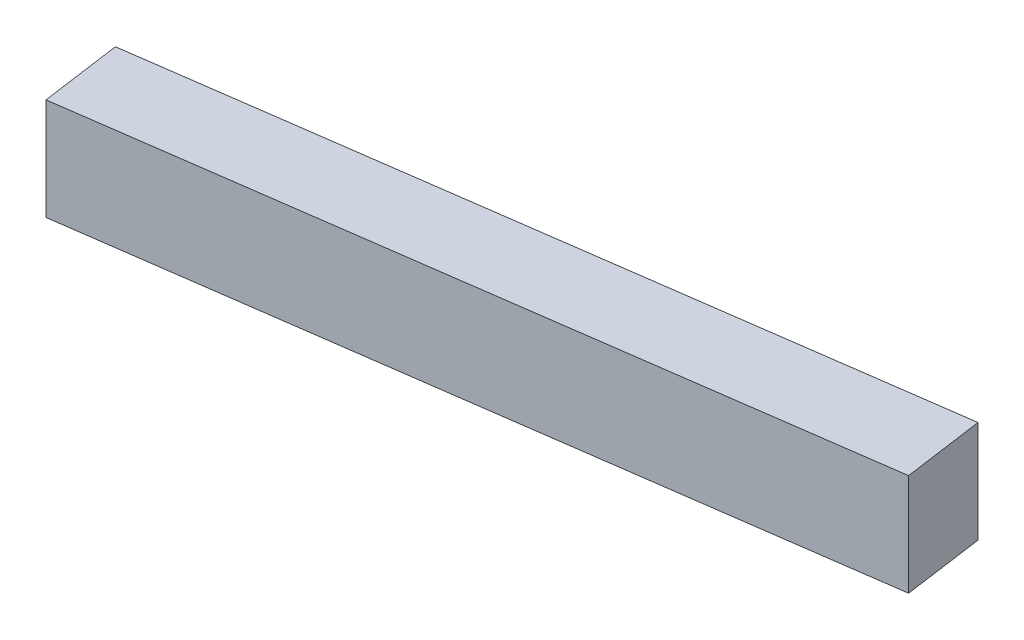
ISO-10303-21;
HEADER;
FILE_DESCRIPTION(('STEP AP214'),'2;1');
FILE_NAME('part.step','',(''),(''),'','','');
FILE_SCHEMA(('AUTOMOTIVE_DESIGN { 1 0 10303 214 1 1 1 1 }'));
ENDSEC;
DATA;
#1=APPLICATION_CONTEXT('core data for automotive mechanical design processes');
#2=APPLICATION_PROTOCOL_DEFINITION('international standard','automotive_design',2000,#1);
#3=PRODUCT_CONTEXT('',#1,'mechanical');
#4=PRODUCT('Part','Part','',(#3));
#5=PRODUCT_RELATED_PRODUCT_CATEGORY('part','',(#4));
#6=PRODUCT_DEFINITION_FORMATION('','',#4);
#7=PRODUCT_DEFINITION_CONTEXT('part definition',#1,'design');
#8=PRODUCT_DEFINITION('design','',#6,#7);
#9=PRODUCT_DEFINITION_SHAPE('','',#8);
#10=(LENGTH_UNIT() NAMED_UNIT(*) SI_UNIT(.MILLI.,.METRE.));
#11=(NAMED_UNIT(*) PLANE_ANGLE_UNIT() SI_UNIT($,.RADIAN.));
#12=(NAMED_UNIT(*) SI_UNIT($,.STERADIAN.) SOLID_ANGLE_UNIT());
#13=UNCERTAINTY_MEASURE_WITH_UNIT(LENGTH_MEASURE(1.E-05),#10,'distance_accuracy_value','');
#14=(GEOMETRIC_REPRESENTATION_CONTEXT(3) GLOBAL_UNCERTAINTY_ASSIGNED_CONTEXT((#13)) GLOBAL_UNIT_ASSIGNED_CONTEXT((#10,
#11,#12)) REPRESENTATION_CONTEXT('',''));
#15=CARTESIAN_POINT('',(0.,0.,0.));
#16=DIRECTION('',(0.,0.,1.));
#17=DIRECTION('',(1.,0.,0.));
#18=AXIS2_PLACEMENT_3D('',#15,#16,#17);
#19=CARTESIAN_POINT('',(17.8104242365873,7.874,-2.59334420117402));
#20=DIRECTION('',(0.138562393050793,0.,0.99035370612324));
#21=DIRECTION('',(0.99035370612324,0.,-0.138562393050793));
#22=AXIS2_PLACEMENT_3D('',#19,#20,#21);
#23=PLANE('',#22);
#24=DIRECTION('',(0.,1.,0.));
#25=VECTOR('',#24,1.);
#26=CARTESIAN_POINT('',(17.8104242365873,7.874,-2.59334420117402));
#27=LINE('',#26,#25);
#28=CARTESIAN_POINT('',(17.8104242365873,7.62,-2.59334420117402));
#29=VERTEX_POINT('',#28);
#30=CARTESIAN_POINT('',(17.8104242365873,7.874,-2.59334420117402));
#31=VERTEX_POINT('',#30);
#32=EDGE_CURVE('E20',#29,#31,#27,.T.);
#33=ORIENTED_EDGE('',*,*,#32,.T.);
#34=DIRECTION('',(0.99035370612324,0.,-0.138562393050798));
#35=VECTOR('',#34,1.);
#36=CARTESIAN_POINT('',(17.8104242365873,7.874,-2.59334420117402));
#37=LINE('',#36,#35);
#38=CARTESIAN_POINT('',(19.697048046752,7.874,-2.85730555993578));
#39=VERTEX_POINT('',#38);
#40=EDGE_CURVE('E55',#31,#39,#37,.T.);
#41=ORIENTED_EDGE('',*,*,#40,.T.);
#42=DIRECTION('',(0.,1.,0.));
#43=VECTOR('',#42,1.);
#44=CARTESIAN_POINT('',(19.697048046752,7.874,-2.85730555993578));
#45=LINE('',#44,#43);
#46=CARTESIAN_POINT('',(19.697048046752,7.62,-2.85730555993578));
#47=VERTEX_POINT('',#46);
#48=EDGE_CURVE('E76',#39,#47,#45,.F.);
#49=ORIENTED_EDGE('',*,*,#48,.T.);
#50=DIRECTION('',(0.99035370612324,0.,-0.138562393050798));
#51=VECTOR('',#50,1.);
#52=CARTESIAN_POINT('',(17.8104242365873,7.62,-2.59334420117402));
#53=LINE('',#52,#51);
#54=EDGE_CURVE('E58',#29,#47,#53,.T.);
#55=ORIENTED_EDGE('',*,*,#54,.F.);
#56=EDGE_LOOP('',(#33,#41,#49,#55));
#57=FACE_BOUND('',#56,.T.);
#58=ADVANCED_FACE('F17',(#57),#23,.F.);
#59=CARTESIAN_POINT('',(17.8104242365873,7.874,-2.59334420117402));
#60=DIRECTION('',(0.990353706123233,0.,-0.138562393050847));
#61=DIRECTION('',(-0.138562393050847,0.,-0.990353706123233));
#62=AXIS2_PLACEMENT_3D('',#59,#60,#61);
#63=PLANE('',#62);
#64=DIRECTION('',(0.,1.,0.));
#65=VECTOR('',#64,1.);
#66=CARTESIAN_POINT('',(17.8385801148552,7.874,-2.39210432808977));
#67=LINE('',#66,#65);
#68=CARTESIAN_POINT('',(17.8385801148552,7.62,-2.39210432808977));
#69=VERTEX_POINT('',#68);
#70=CARTESIAN_POINT('',(17.8385801148552,7.874,-2.39210432808977));
#71=VERTEX_POINT('',#70);
#72=EDGE_CURVE('E73',#69,#71,#67,.T.);
#73=ORIENTED_EDGE('',*,*,#72,.T.);
#74=DIRECTION('',(-0.138562393050692,0.,-0.990353706123255));
#75=VECTOR('',#74,1.);
#76=CARTESIAN_POINT('',(17.8385801148552,7.874,-2.39210432808977));
#77=LINE('',#76,#75);
#78=EDGE_CURVE('E63',#71,#31,#77,.T.);
#79=ORIENTED_EDGE('',*,*,#78,.T.);
#80=ORIENTED_EDGE('',*,*,#32,.F.);
#81=DIRECTION('',(-0.138562393050692,0.,-0.990353706123255));
#82=VECTOR('',#81,1.);
#83=CARTESIAN_POINT('',(17.8385801148552,7.62,-2.39210432808977));
#84=LINE('',#83,#82);
#85=EDGE_CURVE('E80',#69,#29,#84,.T.);
#86=ORIENTED_EDGE('',*,*,#85,.F.);
#87=EDGE_LOOP('',(#73,#79,#80,#86));
#88=FACE_BOUND('',#87,.T.);
#89=ADVANCED_FACE('F72',(#88),#63,.F.);
#90=CARTESIAN_POINT('',(17.8104242365873,7.874,-2.59334420117402));
#91=DIRECTION('',(0.,-1.,0.));
#92=DIRECTION('',(0.,0.,-1.));
#93=AXIS2_PLACEMENT_3D('',#90,#91,#92);
#94=PLANE('',#93);
#95=ORIENTED_EDGE('',*,*,#78,.F.);
#96=DIRECTION('',(-0.99035370612324,0.,0.138562393050794));
#97=VECTOR('',#96,1.);
#98=CARTESIAN_POINT('',(17.8385801148552,7.874,-2.39210432808977));
#99=LINE('',#98,#97);
#100=CARTESIAN_POINT('',(19.7252039253263,7.874,-2.6560656868944));
#101=VERTEX_POINT('',#100);
#102=EDGE_CURVE('E83',#71,#101,#99,.F.);
#103=ORIENTED_EDGE('',*,*,#102,.T.);
#104=DIRECTION('',(0.138562394558436,0.,0.990353705912303));
#105=VECTOR('',#104,1.);
#106=CARTESIAN_POINT('',(19.697048046752,7.874,-2.85730555993578));
#107=LINE('',#106,#105);
#108=EDGE_CURVE('E69',#101,#39,#107,.F.);
#109=ORIENTED_EDGE('',*,*,#108,.T.);
#110=ORIENTED_EDGE('',*,*,#40,.F.);
#111=EDGE_LOOP('',(#95,#103,#109,#110));
#112=FACE_BOUND('',#111,.T.);
#113=ADVANCED_FACE('F66',(#112),#94,.F.);
#114=CARTESIAN_POINT('',(19.697048046752,7.874,-2.85730555993578));
#115=DIRECTION('',(-0.990353705912303,0.,0.138562394558436));
#116=DIRECTION('',(0.138562394558436,0.,0.990353705912303));
#117=AXIS2_PLACEMENT_3D('',#114,#115,#116);
#118=PLANE('',#117);
#119=ORIENTED_EDGE('',*,*,#48,.F.);
#120=ORIENTED_EDGE('',*,*,#108,.F.);
#121=DIRECTION('',(0.,1.,0.));
#122=VECTOR('',#121,1.);
#123=CARTESIAN_POINT('',(19.7252039253263,7.874,-2.65606568689439));
#124=LINE('',#123,#122);
#125=CARTESIAN_POINT('',(19.7252039253263,7.62,-2.6560656868944));
#126=VERTEX_POINT('',#125);
#127=EDGE_CURVE('E26',#101,#126,#124,.F.);
#128=ORIENTED_EDGE('',*,*,#127,.T.);
#129=DIRECTION('',(0.13856239455857,0.,0.990353705912284));
#130=VECTOR('',#129,1.);
#131=CARTESIAN_POINT('',(19.697048046752,7.62,-2.85730555993578));
#132=LINE('',#131,#130);
#133=EDGE_CURVE('E34',#47,#126,#132,.T.);
#134=ORIENTED_EDGE('',*,*,#133,.F.);
#135=EDGE_LOOP('',(#119,#120,#128,#134));
#136=FACE_BOUND('',#135,.T.);
#137=ADVANCED_FACE('F88',(#136),#118,.F.);
#138=CARTESIAN_POINT('',(17.8104242365873,7.62,-2.59334420117402));
#139=DIRECTION('',(0.,-1.,0.));
#140=DIRECTION('',(0.,0.,-1.));
#141=AXIS2_PLACEMENT_3D('',#138,#139,#140);
#142=PLANE('',#141);
#143=DIRECTION('',(-0.99035370612324,0.,0.138562393050794));
#144=VECTOR('',#143,1.);
#145=CARTESIAN_POINT('',(17.8385801148552,7.62,-2.39210432808977));
#146=LINE('',#145,#144);
#147=EDGE_CURVE('E11',#126,#69,#146,.T.);
#148=ORIENTED_EDGE('',*,*,#147,.T.);
#149=ORIENTED_EDGE('',*,*,#85,.T.);
#150=ORIENTED_EDGE('',*,*,#54,.T.);
#151=ORIENTED_EDGE('',*,*,#133,.T.);
#152=EDGE_LOOP('',(#148,#149,#150,#151));
#153=FACE_BOUND('',#152,.T.);
#154=ADVANCED_FACE('F91',(#153),#142,.T.);
#155=CARTESIAN_POINT('',(17.8385801148552,7.874,-2.39210432808977));
#156=DIRECTION('',(-0.138562393050794,0.,-0.99035370612324));
#157=DIRECTION('',(-0.99035370612324,0.,0.138562393050794));
#158=AXIS2_PLACEMENT_3D('',#155,#156,#157);
#159=PLANE('',#158);
#160=ORIENTED_EDGE('',*,*,#127,.F.);
#161=ORIENTED_EDGE('',*,*,#102,.F.);
#162=ORIENTED_EDGE('',*,*,#72,.F.);
#163=ORIENTED_EDGE('',*,*,#147,.F.);
#164=EDGE_LOOP('',(#160,#161,#162,#163));
#165=FACE_BOUND('',#164,.T.);
#166=ADVANCED_FACE('F90',(#165),#159,.F.);
#167=CLOSED_SHELL('',(#58,#89,#113,#137,#154,#166));
#168=MANIFOLD_SOLID_BREP('B1',#167);
#169=ADVANCED_BREP_SHAPE_REPRESENTATION('',(#18,#168),#14);
#170=SHAPE_DEFINITION_REPRESENTATION(#9,#169);
ENDSEC;
END-ISO-10303-21;
